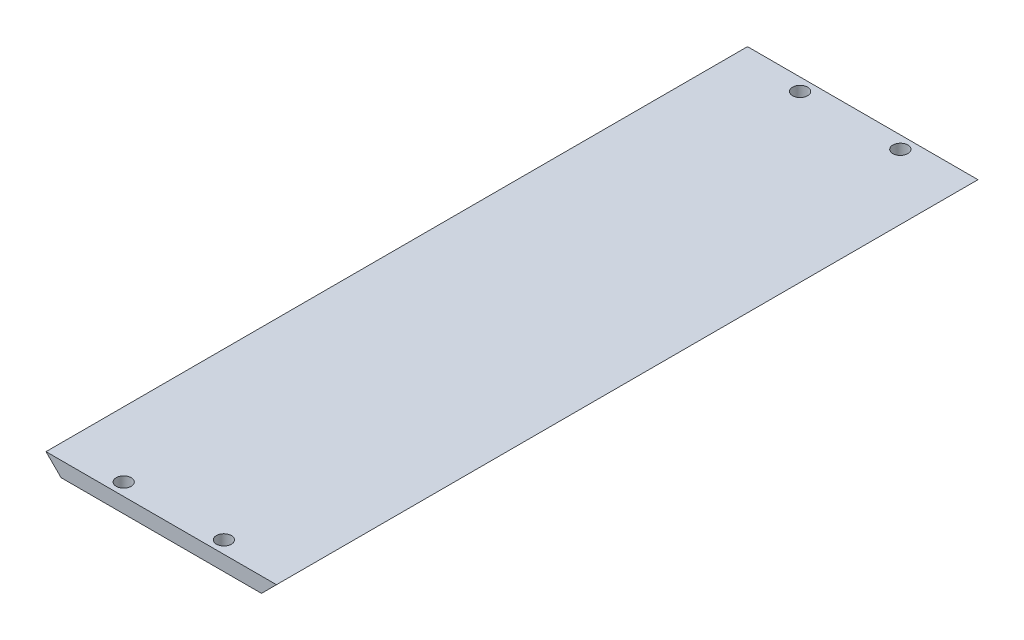
ISO-10303-21;
HEADER;
FILE_DESCRIPTION(('STEP AP214'),'2;1');
FILE_NAME('part.step','',(''),(''),'','','');
FILE_SCHEMA(('AUTOMOTIVE_DESIGN { 1 0 10303 214 1 1 1 1 }'));
ENDSEC;
DATA;
#1=APPLICATION_CONTEXT('core data for automotive mechanical design processes');
#2=APPLICATION_PROTOCOL_DEFINITION('international standard','automotive_design',2000,#1);
#3=PRODUCT_CONTEXT('',#1,'mechanical');
#4=PRODUCT('Part','Part','',(#3));
#5=PRODUCT_RELATED_PRODUCT_CATEGORY('part','',(#4));
#6=PRODUCT_DEFINITION_FORMATION('','',#4);
#7=PRODUCT_DEFINITION_CONTEXT('part definition',#1,'design');
#8=PRODUCT_DEFINITION('design','',#6,#7);
#9=PRODUCT_DEFINITION_SHAPE('','',#8);
#10=(LENGTH_UNIT() NAMED_UNIT(*) SI_UNIT(.MILLI.,.METRE.));
#11=(NAMED_UNIT(*) PLANE_ANGLE_UNIT() SI_UNIT($,.RADIAN.));
#12=(NAMED_UNIT(*) SI_UNIT($,.STERADIAN.) SOLID_ANGLE_UNIT());
#13=UNCERTAINTY_MEASURE_WITH_UNIT(LENGTH_MEASURE(1.E-05),#10,'distance_accuracy_value','');
#14=(GEOMETRIC_REPRESENTATION_CONTEXT(3) GLOBAL_UNCERTAINTY_ASSIGNED_CONTEXT((#13)) GLOBAL_UNIT_ASSIGNED_CONTEXT((#10,
#11,#12)) REPRESENTATION_CONTEXT('',''));
#15=CARTESIAN_POINT('',(0.,0.,0.));
#16=DIRECTION('',(0.,0.,1.));
#17=DIRECTION('',(1.,0.,0.));
#18=AXIS2_PLACEMENT_3D('',#15,#16,#17);
#19=CARTESIAN_POINT('',(0.,0.,0.));
#20=DIRECTION('',(0.,-1.,0.));
#21=DIRECTION('',(0.,0.,-1.));
#22=AXIS2_PLACEMENT_3D('',#19,#20,#21);
#23=PLANE('',#22);
#24=CARTESIAN_POINT('',(9.99999999999999,0.,67.5));
#25=DIRECTION('',(0.,1.,0.));
#26=DIRECTION('',(0.,0.,1.));
#27=AXIS2_PLACEMENT_3D('',#24,#25,#26);
#28=CIRCLE('',#27,1.5);
#29=CARTESIAN_POINT('',(9.99999999999999,0.,69.));
#30=VERTEX_POINT('',#29);
#31=EDGE_CURVE('E148',#30,#30,#28,.T.);
#32=ORIENTED_EDGE('',*,*,#31,.T.);
#33=EDGE_LOOP('',(#32));
#34=FACE_BOUND('',#33,.T.);
#35=CARTESIAN_POINT('',(-9.99999999999999,0.,-67.5));
#36=DIRECTION('',(0.,1.,0.));
#37=DIRECTION('',(0.,0.,1.));
#38=AXIS2_PLACEMENT_3D('',#35,#36,#37);
#39=CIRCLE('',#38,1.5);
#40=CARTESIAN_POINT('',(-9.99999999999999,0.,-66.));
#41=VERTEX_POINT('',#40);
#42=EDGE_CURVE('E157',#41,#41,#39,.T.);
#43=ORIENTED_EDGE('',*,*,#42,.T.);
#44=EDGE_LOOP('',(#43));
#45=FACE_BOUND('',#44,.T.);
#46=DIRECTION('',(-1.,0.,0.));
#47=VECTOR('',#46,1.);
#48=CARTESIAN_POINT('',(-25.,0.,-70.));
#49=LINE('',#48,#47);
#50=CARTESIAN_POINT('',(20.,0.,-70.));
#51=VERTEX_POINT('',#50);
#52=CARTESIAN_POINT('',(-20.,0.,-70.));
#53=VERTEX_POINT('',#52);
#54=EDGE_CURVE('E113',#51,#53,#49,.T.);
#55=ORIENTED_EDGE('',*,*,#54,.F.);
#56=DIRECTION('',(0.,0.,-1.));
#57=VECTOR('',#56,1.);
#58=CARTESIAN_POINT('',(20.,0.,0.));
#59=LINE('',#58,#57);
#60=CARTESIAN_POINT('',(20.,0.,70.));
#61=VERTEX_POINT('',#60);
#62=EDGE_CURVE('E107',#61,#51,#59,.T.);
#63=ORIENTED_EDGE('',*,*,#62,.F.);
#64=DIRECTION('',(1.,0.,0.));
#65=VECTOR('',#64,1.);
#66=CARTESIAN_POINT('',(-25.,0.,70.));
#67=LINE('',#66,#65);
#68=CARTESIAN_POINT('',(-20.,0.,70.));
#69=VERTEX_POINT('',#68);
#70=EDGE_CURVE('E120',#69,#61,#67,.T.);
#71=ORIENTED_EDGE('',*,*,#70,.F.);
#72=DIRECTION('',(0.,0.,-1.));
#73=VECTOR('',#72,1.);
#74=CARTESIAN_POINT('',(-20.,0.,0.));
#75=LINE('',#74,#73);
#76=EDGE_CURVE('E54',#69,#53,#75,.T.);
#77=ORIENTED_EDGE('',*,*,#76,.T.);
#78=EDGE_LOOP('',(#55,#63,#71,#77));
#79=FACE_BOUND('',#78,.T.);
#80=CARTESIAN_POINT('',(9.99999999999999,0.,-67.5));
#81=DIRECTION('',(0.,-1.,0.));
#82=DIRECTION('',(0.,0.,-1.));
#83=AXIS2_PLACEMENT_3D('',#80,#81,#82);
#84=CIRCLE('',#83,1.5);
#85=CARTESIAN_POINT('',(9.99999999999999,0.,-69.));
#86=VERTEX_POINT('',#85);
#87=EDGE_CURVE('E136',#86,#86,#84,.T.);
#88=ORIENTED_EDGE('',*,*,#87,.F.);
#89=EDGE_LOOP('',(#88));
#90=FACE_BOUND('',#89,.T.);
#91=CARTESIAN_POINT('',(-9.99999999999999,0.,67.5));
#92=DIRECTION('',(0.,-1.,0.));
#93=DIRECTION('',(0.,0.,-1.));
#94=AXIS2_PLACEMENT_3D('',#91,#92,#93);
#95=CIRCLE('',#94,1.5);
#96=CARTESIAN_POINT('',(-9.99999999999999,0.,66.));
#97=VERTEX_POINT('',#96);
#98=EDGE_CURVE('E139',#97,#97,#95,.T.);
#99=ORIENTED_EDGE('',*,*,#98,.F.);
#100=EDGE_LOOP('',(#99));
#101=FACE_BOUND('',#100,.T.);
#102=ADVANCED_FACE('F45',(#34,#45,#79,#90,#101),#23,.T.);
#103=CARTESIAN_POINT('',(25.,3.,127.));
#104=DIRECTION('',(0.,-1.,0.));
#105=DIRECTION('',(0.,0.,-1.));
#106=AXIS2_PLACEMENT_3D('',#103,#104,#105);
#107=PLANE('',#106);
#108=CARTESIAN_POINT('',(9.99999999999999,3.,-67.5));
#109=DIRECTION('',(0.,-1.,0.));
#110=DIRECTION('',(0.,0.,-1.));
#111=AXIS2_PLACEMENT_3D('',#108,#109,#110);
#112=CIRCLE('',#111,1.5);
#113=CARTESIAN_POINT('',(9.99999999999999,3.,-69.));
#114=VERTEX_POINT('',#113);
#115=EDGE_CURVE('E189',#114,#114,#112,.T.);
#116=ORIENTED_EDGE('',*,*,#115,.T.);
#117=EDGE_LOOP('',(#116));
#118=FACE_BOUND('',#117,.T.);
#119=CARTESIAN_POINT('',(-9.99999999999999,3.,-67.5));
#120=DIRECTION('',(0.,1.,0.));
#121=DIRECTION('',(0.,0.,1.));
#122=AXIS2_PLACEMENT_3D('',#119,#120,#121);
#123=CIRCLE('',#122,1.5);
#124=CARTESIAN_POINT('',(-9.99999999999999,3.,-66.));
#125=VERTEX_POINT('',#124);
#126=EDGE_CURVE('E103',#125,#125,#123,.T.);
#127=ORIENTED_EDGE('',*,*,#126,.F.);
#128=EDGE_LOOP('',(#127));
#129=FACE_BOUND('',#128,.T.);
#130=DIRECTION('',(-1.,0.,0.));
#131=VECTOR('',#130,1.);
#132=CARTESIAN_POINT('',(25.,3.,-70.));
#133=LINE('',#132,#131);
#134=CARTESIAN_POINT('',(23.,3.,-70.));
#135=VERTEX_POINT('',#134);
#136=CARTESIAN_POINT('',(-23.,3.,-70.));
#137=VERTEX_POINT('',#136);
#138=EDGE_CURVE('E60',#135,#137,#133,.T.);
#139=ORIENTED_EDGE('',*,*,#138,.T.);
#140=DIRECTION('',(0.,0.,1.));
#141=VECTOR('',#140,1.);
#142=CARTESIAN_POINT('',(-23.,3.,-82.0000000000001));
#143=LINE('',#142,#141);
#144=CARTESIAN_POINT('',(-23.,3.,70.));
#145=VERTEX_POINT('',#144);
#146=EDGE_CURVE('E11',#137,#145,#143,.T.);
#147=ORIENTED_EDGE('',*,*,#146,.T.);
#148=DIRECTION('',(-1.,0.,0.));
#149=VECTOR('',#148,1.);
#150=CARTESIAN_POINT('',(-25.,3.,70.));
#151=LINE('',#150,#149);
#152=CARTESIAN_POINT('',(23.,3.,70.));
#153=VERTEX_POINT('',#152);
#154=EDGE_CURVE('E89',#153,#145,#151,.T.);
#155=ORIENTED_EDGE('',*,*,#154,.F.);
#156=DIRECTION('',(0.,0.,1.));
#157=VECTOR('',#156,1.);
#158=CARTESIAN_POINT('',(23.,3.,-82.0000000000001));
#159=LINE('',#158,#157);
#160=EDGE_CURVE('E85',#135,#153,#159,.T.);
#161=ORIENTED_EDGE('',*,*,#160,.F.);
#162=EDGE_LOOP('',(#139,#147,#155,#161));
#163=FACE_BOUND('',#162,.T.);
#164=CARTESIAN_POINT('',(9.99999999999999,3.,67.5));
#165=DIRECTION('',(0.,1.,0.));
#166=DIRECTION('',(0.,0.,1.));
#167=AXIS2_PLACEMENT_3D('',#164,#165,#166);
#168=CIRCLE('',#167,1.5);
#169=CARTESIAN_POINT('',(9.99999999999999,3.,69.));
#170=VERTEX_POINT('',#169);
#171=EDGE_CURVE('E142',#170,#170,#168,.T.);
#172=ORIENTED_EDGE('',*,*,#171,.F.);
#173=EDGE_LOOP('',(#172));
#174=FACE_BOUND('',#173,.T.);
#175=CARTESIAN_POINT('',(-9.99999999999999,3.,67.5));
#176=DIRECTION('',(0.,-1.,0.));
#177=DIRECTION('',(0.,0.,-1.));
#178=AXIS2_PLACEMENT_3D('',#175,#176,#177);
#179=CIRCLE('',#178,1.5);
#180=CARTESIAN_POINT('',(-9.99999999999999,3.,66.));
#181=VERTEX_POINT('',#180);
#182=EDGE_CURVE('E143',#181,#181,#179,.T.);
#183=ORIENTED_EDGE('',*,*,#182,.T.);
#184=EDGE_LOOP('',(#183));
#185=FACE_BOUND('',#184,.T.);
#186=ADVANCED_FACE('F86',(#118,#129,#163,#174,#185),#107,.F.);
#187=CARTESIAN_POINT('',(-25.,5.,-70.));
#188=DIRECTION('',(0.,0.,1.));
#189=DIRECTION('',(1.,0.,0.));
#190=AXIS2_PLACEMENT_3D('',#187,#188,#189);
#191=PLANE('',#190);
#192=DIRECTION('',(-0.707106781186548,-0.707106781186548,0.));
#193=VECTOR('',#192,1.);
#194=CARTESIAN_POINT('',(0.,-20.,-70.));
#195=LINE('',#194,#193);
#196=EDGE_CURVE('E100',#135,#51,#195,.T.);
#197=ORIENTED_EDGE('',*,*,#196,.T.);
#198=ORIENTED_EDGE('',*,*,#54,.T.);
#199=DIRECTION('',(0.707106781186548,-0.707106781186548,0.));
#200=VECTOR('',#199,1.);
#201=CARTESIAN_POINT('',(-25.,5.,-70.));
#202=LINE('',#201,#200);
#203=EDGE_CURVE('E101',#137,#53,#202,.T.);
#204=ORIENTED_EDGE('',*,*,#203,.F.);
#205=ORIENTED_EDGE('',*,*,#138,.F.);
#206=EDGE_LOOP('',(#197,#198,#204,#205));
#207=FACE_BOUND('',#206,.T.);
#208=ADVANCED_FACE('F47',(#207),#191,.F.);
#209=CARTESIAN_POINT('',(-25.,5.,70.));
#210=DIRECTION('',(0.,0.,-1.));
#211=DIRECTION('',(-1.,0.,0.));
#212=AXIS2_PLACEMENT_3D('',#209,#210,#211);
#213=PLANE('',#212);
#214=DIRECTION('',(-0.707106781186548,-0.707106781186548,0.));
#215=VECTOR('',#214,1.);
#216=CARTESIAN_POINT('',(10.,-10.,70.));
#217=LINE('',#216,#215);
#218=EDGE_CURVE('E94',#153,#61,#217,.T.);
#219=ORIENTED_EDGE('',*,*,#218,.F.);
#220=ORIENTED_EDGE('',*,*,#154,.T.);
#221=DIRECTION('',(0.707106781186548,-0.707106781186548,0.));
#222=VECTOR('',#221,1.);
#223=CARTESIAN_POINT('',(-10.,-10.,70.));
#224=LINE('',#223,#222);
#225=EDGE_CURVE('E109',#145,#69,#224,.T.);
#226=ORIENTED_EDGE('',*,*,#225,.T.);
#227=ORIENTED_EDGE('',*,*,#70,.T.);
#228=EDGE_LOOP('',(#219,#220,#226,#227));
#229=FACE_BOUND('',#228,.T.);
#230=ADVANCED_FACE('F127',(#229),#213,.F.);
#231=CARTESIAN_POINT('',(10.,-10.,-82.0000000000001));
#232=DIRECTION('',(-0.707106781186548,0.707106781186548,0.));
#233=DIRECTION('',(-0.707106781186548,-0.707106781186548,0.));
#234=AXIS2_PLACEMENT_3D('',#231,#232,#233);
#235=PLANE('',#234);
#236=ORIENTED_EDGE('',*,*,#196,.F.);
#237=ORIENTED_EDGE('',*,*,#160,.T.);
#238=ORIENTED_EDGE('',*,*,#218,.T.);
#239=ORIENTED_EDGE('',*,*,#62,.T.);
#240=EDGE_LOOP('',(#236,#237,#238,#239));
#241=FACE_BOUND('',#240,.T.);
#242=ADVANCED_FACE('F105',(#241),#235,.F.);
#243=CARTESIAN_POINT('',(-10.,-10.,-82.0000000000001));
#244=DIRECTION('',(-0.707106781186548,-0.707106781186548,0.));
#245=DIRECTION('',(0.707106781186548,-0.707106781186548,0.));
#246=AXIS2_PLACEMENT_3D('',#243,#244,#245);
#247=PLANE('',#246);
#248=ORIENTED_EDGE('',*,*,#146,.F.);
#249=ORIENTED_EDGE('',*,*,#203,.T.);
#250=ORIENTED_EDGE('',*,*,#76,.F.);
#251=ORIENTED_EDGE('',*,*,#225,.F.);
#252=EDGE_LOOP('',(#248,#249,#250,#251));
#253=FACE_BOUND('',#252,.T.);
#254=ADVANCED_FACE('F163',(#253),#247,.T.);
#255=CARTESIAN_POINT('',(-9.99999999999999,3.,-67.5));
#256=DIRECTION('',(0.,-1.,0.));
#257=DIRECTION('',(0.,0.,-1.));
#258=AXIS2_PLACEMENT_3D('',#255,#256,#257);
#259=CYLINDRICAL_SURFACE('',#258,1.5);
#260=ORIENTED_EDGE('',*,*,#126,.T.);
#261=EDGE_LOOP('',(#260));
#262=FACE_BOUND('',#261,.T.);
#263=ORIENTED_EDGE('',*,*,#42,.F.);
#264=EDGE_LOOP('',(#263));
#265=FACE_BOUND('',#264,.T.);
#266=ADVANCED_FACE('F165',(#262,#265),#259,.F.);
#267=CARTESIAN_POINT('',(9.99999999999999,3.,-67.5));
#268=DIRECTION('',(0.,-1.,0.));
#269=DIRECTION('',(0.,0.,-1.));
#270=AXIS2_PLACEMENT_3D('',#267,#268,#269);
#271=CYLINDRICAL_SURFACE('',#270,1.5);
#272=ORIENTED_EDGE('',*,*,#115,.F.);
#273=EDGE_LOOP('',(#272));
#274=FACE_BOUND('',#273,.T.);
#275=ORIENTED_EDGE('',*,*,#87,.T.);
#276=EDGE_LOOP('',(#275));
#277=FACE_BOUND('',#276,.T.);
#278=ADVANCED_FACE('F171',(#274,#277),#271,.F.);
#279=CARTESIAN_POINT('',(9.99999999999999,3.,67.5));
#280=DIRECTION('',(0.,-1.,0.));
#281=DIRECTION('',(0.,0.,-1.));
#282=AXIS2_PLACEMENT_3D('',#279,#280,#281);
#283=CYLINDRICAL_SURFACE('',#282,1.5);
#284=ORIENTED_EDGE('',*,*,#171,.T.);
#285=EDGE_LOOP('',(#284));
#286=FACE_BOUND('',#285,.T.);
#287=ORIENTED_EDGE('',*,*,#31,.F.);
#288=EDGE_LOOP('',(#287));
#289=FACE_BOUND('',#288,.T.);
#290=ADVANCED_FACE('F203',(#286,#289),#283,.F.);
#291=CARTESIAN_POINT('',(-9.99999999999999,3.,67.5));
#292=DIRECTION('',(0.,-1.,0.));
#293=DIRECTION('',(0.,0.,-1.));
#294=AXIS2_PLACEMENT_3D('',#291,#292,#293);
#295=CYLINDRICAL_SURFACE('',#294,1.5);
#296=ORIENTED_EDGE('',*,*,#182,.F.);
#297=EDGE_LOOP('',(#296));
#298=FACE_BOUND('',#297,.T.);
#299=ORIENTED_EDGE('',*,*,#98,.T.);
#300=EDGE_LOOP('',(#299));
#301=FACE_BOUND('',#300,.T.);
#302=ADVANCED_FACE('F205',(#298,#301),#295,.F.);
#303=CLOSED_SHELL('',(#102,#186,#208,#230,#242,#254,#266,#278,#290,#302));
#304=MANIFOLD_SOLID_BREP('B2',#303);
#305=ADVANCED_BREP_SHAPE_REPRESENTATION('',(#18,#304),#14);
#306=SHAPE_DEFINITION_REPRESENTATION(#9,#305);
ENDSEC;
END-ISO-10303-21;
